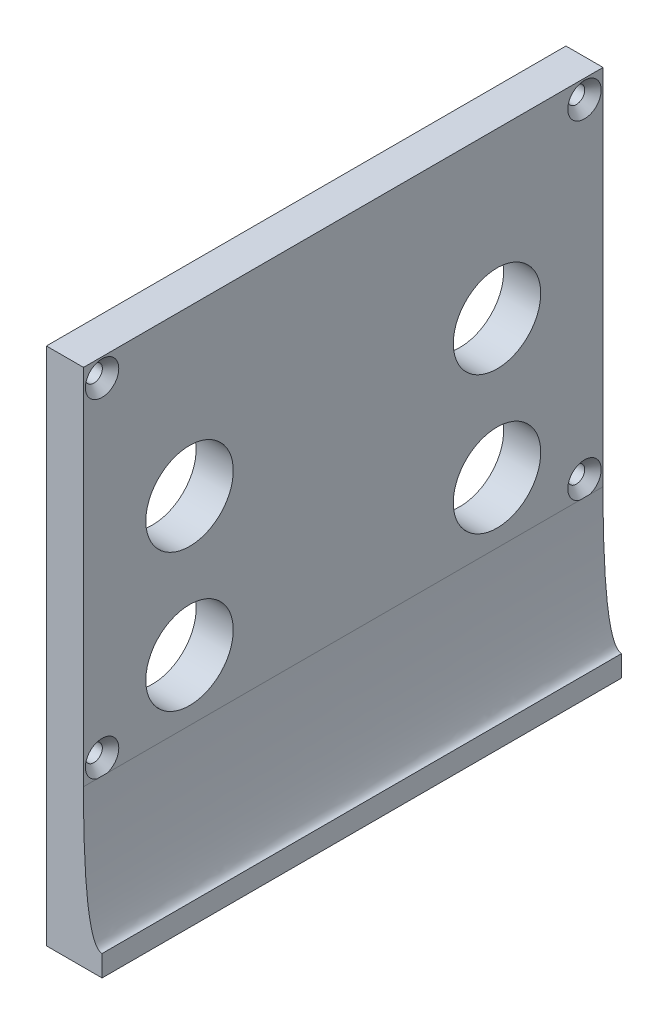
ISO-10303-21;
HEADER;
FILE_DESCRIPTION(('STEP AP214'),'2;1');
FILE_NAME('part.step','',(''),(''),'','','');
FILE_SCHEMA(('AUTOMOTIVE_DESIGN { 1 0 10303 214 1 1 1 1 }'));
ENDSEC;
DATA;
#1=APPLICATION_CONTEXT('core data for automotive mechanical design processes');
#2=APPLICATION_PROTOCOL_DEFINITION('international standard','automotive_design',2000,#1);
#3=PRODUCT_CONTEXT('',#1,'mechanical');
#4=PRODUCT('Part','Part','',(#3));
#5=PRODUCT_RELATED_PRODUCT_CATEGORY('part','',(#4));
#6=PRODUCT_DEFINITION_FORMATION('','',#4);
#7=PRODUCT_DEFINITION_CONTEXT('part definition',#1,'design');
#8=PRODUCT_DEFINITION('design','',#6,#7);
#9=PRODUCT_DEFINITION_SHAPE('','',#8);
#10=(LENGTH_UNIT() NAMED_UNIT(*) SI_UNIT(.MILLI.,.METRE.));
#11=(NAMED_UNIT(*) PLANE_ANGLE_UNIT() SI_UNIT($,.RADIAN.));
#12=(NAMED_UNIT(*) SI_UNIT($,.STERADIAN.) SOLID_ANGLE_UNIT());
#13=UNCERTAINTY_MEASURE_WITH_UNIT(LENGTH_MEASURE(1.E-05),#10,'distance_accuracy_value','');
#14=(GEOMETRIC_REPRESENTATION_CONTEXT(3) GLOBAL_UNCERTAINTY_ASSIGNED_CONTEXT((#13)) GLOBAL_UNIT_ASSIGNED_CONTEXT((#10,
#11,#12)) REPRESENTATION_CONTEXT('',''));
#15=CARTESIAN_POINT('',(0.,0.,0.));
#16=DIRECTION('',(0.,0.,1.));
#17=DIRECTION('',(1.,0.,0.));
#18=AXIS2_PLACEMENT_3D('',#15,#16,#17);
#19=CARTESIAN_POINT('',(-39.838690811529,41.5674555111962,98.));
#20=DIRECTION('',(-1.,0.,0.));
#21=DIRECTION('',(0.,0.,1.));
#22=AXIS2_PLACEMENT_3D('',#19,#20,#21);
#23=PLANE('',#22);
#24=CARTESIAN_POINT('',(-39.838690811529,38.0674555111962,94.5));
#25=DIRECTION('',(1.,0.,0.));
#26=DIRECTION('',(0.,0.,-1.));
#27=AXIS2_PLACEMENT_3D('',#24,#25,#26);
#28=CIRCLE('',#27,3.15);
#29=CARTESIAN_POINT('',(-39.838690811529,38.0674555111962,91.35));
#30=VERTEX_POINT('',#29);
#31=EDGE_CURVE('E160',#30,#30,#28,.T.);
#32=ORIENTED_EDGE('',*,*,#31,.F.);
#33=EDGE_LOOP('',(#32));
#34=FACE_BOUND('',#33,.T.);
#35=CARTESIAN_POINT('',(-39.838690811529,38.0674555111962,3.50000000000002));
#36=DIRECTION('',(1.,0.,0.));
#37=DIRECTION('',(0.,0.,-1.));
#38=AXIS2_PLACEMENT_3D('',#35,#36,#37);
#39=CIRCLE('',#38,3.15);
#40=CARTESIAN_POINT('',(-39.838690811529,38.0674555111962,0.350000000000017));
#41=VERTEX_POINT('',#40);
#42=EDGE_CURVE('E183',#41,#41,#39,.T.);
#43=ORIENTED_EDGE('',*,*,#42,.F.);
#44=EDGE_LOOP('',(#43));
#45=FACE_BOUND('',#44,.T.);
#46=CARTESIAN_POINT('',(-39.838690811529,-15.4325444888038,20.));
#47=DIRECTION('',(-1.,0.,0.));
#48=DIRECTION('',(0.,0.,1.));
#49=AXIS2_PLACEMENT_3D('',#46,#47,#48);
#50=CIRCLE('',#49,8.25);
#51=CARTESIAN_POINT('',(-39.838690811529,-15.4325444888038,28.25));
#52=VERTEX_POINT('',#51);
#53=EDGE_CURVE('E257',#52,#52,#50,.T.);
#54=ORIENTED_EDGE('',*,*,#53,.T.);
#55=EDGE_LOOP('',(#54));
#56=FACE_BOUND('',#55,.T.);
#57=CARTESIAN_POINT('',(-39.838690811529,10.5674555111962,78.));
#58=DIRECTION('',(-1.,0.,0.));
#59=DIRECTION('',(0.,0.,1.));
#60=AXIS2_PLACEMENT_3D('',#57,#58,#59);
#61=CIRCLE('',#60,8.25000000000001);
#62=CARTESIAN_POINT('',(-39.838690811529,10.5674555111962,86.25));
#63=VERTEX_POINT('',#62);
#64=EDGE_CURVE('E261',#63,#63,#61,.T.);
#65=ORIENTED_EDGE('',*,*,#64,.T.);
#66=EDGE_LOOP('',(#65));
#67=FACE_BOUND('',#66,.T.);
#68=CARTESIAN_POINT('',(-39.838690811529,-15.4325444888038,78.));
#69=DIRECTION('',(-1.,0.,0.));
#70=DIRECTION('',(0.,0.,1.));
#71=AXIS2_PLACEMENT_3D('',#68,#69,#70);
#72=CIRCLE('',#71,8.25);
#73=CARTESIAN_POINT('',(-39.838690811529,-15.4325444888038,86.25));
#74=VERTEX_POINT('',#73);
#75=EDGE_CURVE('E265',#74,#74,#72,.T.);
#76=ORIENTED_EDGE('',*,*,#75,.T.);
#77=EDGE_LOOP('',(#76));
#78=FACE_BOUND('',#77,.T.);
#79=CARTESIAN_POINT('',(-39.838690811529,10.5674555111962,20.));
#80=DIRECTION('',(-1.,0.,0.));
#81=DIRECTION('',(0.,0.,1.));
#82=AXIS2_PLACEMENT_3D('',#79,#80,#81);
#83=CIRCLE('',#82,8.25);
#84=CARTESIAN_POINT('',(-39.838690811529,10.5674555111962,28.25));
#85=VERTEX_POINT('',#84);
#86=EDGE_CURVE('E202',#85,#85,#83,.T.);
#87=ORIENTED_EDGE('',*,*,#86,.T.);
#88=EDGE_LOOP('',(#87));
#89=FACE_BOUND('',#88,.T.);
#90=CARTESIAN_POINT('',(-39.838690811529,-23.9325444888039,94.5));
#91=DIRECTION('',(1.,0.,0.));
#92=DIRECTION('',(0.,0.,-1.));
#93=AXIS2_PLACEMENT_3D('',#90,#91,#92);
#94=CIRCLE('',#93,3.15);
#95=CARTESIAN_POINT('',(-39.838690811529,-26.9325444888039,93.5395313643851));
#96=VERTEX_POINT('',#95);
#97=CARTESIAN_POINT('',(-39.838690811529,-26.9325444888039,95.4604686356149));
#98=VERTEX_POINT('',#97);
#99=EDGE_CURVE('E171',#96,#98,#94,.T.);
#100=ORIENTED_EDGE('',*,*,#99,.F.);
#101=DIRECTION('',(0.,0.,-1.));
#102=VECTOR('',#101,1.);
#103=CARTESIAN_POINT('',(-39.838690811529,-26.9325444888039,98.));
#104=LINE('',#103,#102);
#105=CARTESIAN_POINT('',(-39.838690811529,-26.9325444888039,4.46046863561494));
#106=VERTEX_POINT('',#105);
#107=EDGE_CURVE('E273',#96,#106,#104,.T.);
#108=ORIENTED_EDGE('',*,*,#107,.T.);
#109=CARTESIAN_POINT('',(-39.838690811529,-23.9325444888039,3.50000000000002));
#110=DIRECTION('',(1.,0.,0.));
#111=DIRECTION('',(0.,0.,-1.));
#112=AXIS2_PLACEMENT_3D('',#109,#110,#111);
#113=CIRCLE('',#112,3.15);
#114=CARTESIAN_POINT('',(-39.838690811529,-26.9325444888039,2.5395313643851));
#115=VERTEX_POINT('',#114);
#116=EDGE_CURVE('E179',#115,#106,#113,.T.);
#117=ORIENTED_EDGE('',*,*,#116,.F.);
#118=CARTESIAN_POINT('',(-39.838690811529,-26.9325444888039,0.));
#119=VERTEX_POINT('',#118);
#120=EDGE_CURVE('E286',#115,#119,#104,.T.);
#121=ORIENTED_EDGE('',*,*,#120,.T.);
#122=DIRECTION('',(0.,1.,0.));
#123=VECTOR('',#122,1.);
#124=CARTESIAN_POINT('',(-39.838690811529,41.5674555111962,0.));
#125=LINE('',#124,#123);
#126=CARTESIAN_POINT('',(-39.838690811529,41.5674555111962,0.));
#127=VERTEX_POINT('',#126);
#128=EDGE_CURVE('E207',#119,#127,#125,.T.);
#129=ORIENTED_EDGE('',*,*,#128,.T.);
#130=DIRECTION('',(0.,0.,-1.));
#131=VECTOR('',#130,1.);
#132=CARTESIAN_POINT('',(-39.838690811529,41.5674555111962,98.));
#133=LINE('',#132,#131);
#134=CARTESIAN_POINT('',(-39.838690811529,41.5674555111962,98.));
#135=VERTEX_POINT('',#134);
#136=EDGE_CURVE('E316',#135,#127,#133,.T.);
#137=ORIENTED_EDGE('',*,*,#136,.F.);
#138=DIRECTION('',(0.,1.,0.));
#139=VECTOR('',#138,1.);
#140=CARTESIAN_POINT('',(-39.838690811529,41.5674555111962,98.));
#141=LINE('',#140,#139);
#142=CARTESIAN_POINT('',(-39.838690811529,-26.9325444888039,98.));
#143=VERTEX_POINT('',#142);
#144=EDGE_CURVE('E218',#143,#135,#141,.T.);
#145=ORIENTED_EDGE('',*,*,#144,.F.);
#146=EDGE_CURVE('E277',#143,#98,#104,.T.);
#147=ORIENTED_EDGE('',*,*,#146,.T.);
#148=EDGE_LOOP('',(#100,#108,#117,#121,#129,#137,#145,#147));
#149=FACE_BOUND('',#148,.T.);
#150=ADVANCED_FACE('F34',(#34,#45,#56,#67,#78,#89,#149),#23,.F.);
#151=CARTESIAN_POINT('',(-46.838690811529,41.5674555111962,98.));
#152=DIRECTION('',(0.,-1.,0.));
#153=DIRECTION('',(0.,0.,-1.));
#154=AXIS2_PLACEMENT_3D('',#151,#152,#153);
#155=PLANE('',#154);
#156=DIRECTION('',(-1.,0.,0.));
#157=VECTOR('',#156,1.);
#158=CARTESIAN_POINT('',(-46.838690811529,41.5674555111962,0.));
#159=LINE('',#158,#157);
#160=CARTESIAN_POINT('',(-46.838690811529,41.5674555111962,0.));
#161=VERTEX_POINT('',#160);
#162=EDGE_CURVE('E304',#127,#161,#159,.T.);
#163=ORIENTED_EDGE('',*,*,#162,.T.);
#164=DIRECTION('',(0.,0.,-1.));
#165=VECTOR('',#164,1.);
#166=CARTESIAN_POINT('',(-46.838690811529,41.5674555111962,98.));
#167=LINE('',#166,#165);
#168=CARTESIAN_POINT('',(-46.838690811529,41.5674555111962,98.));
#169=VERTEX_POINT('',#168);
#170=EDGE_CURVE('E11',#169,#161,#167,.T.);
#171=ORIENTED_EDGE('',*,*,#170,.F.);
#172=DIRECTION('',(-1.,0.,0.));
#173=VECTOR('',#172,1.);
#174=CARTESIAN_POINT('',(-46.838690811529,41.5674555111962,98.));
#175=LINE('',#174,#173);
#176=EDGE_CURVE('E203',#135,#169,#175,.T.);
#177=ORIENTED_EDGE('',*,*,#176,.F.);
#178=ORIENTED_EDGE('',*,*,#136,.T.);
#179=EDGE_LOOP('',(#163,#171,#177,#178));
#180=FACE_BOUND('',#179,.T.);
#181=ADVANCED_FACE('F36',(#180),#155,.F.);
#182=CARTESIAN_POINT('',(-46.838690811529,41.5674555111962,98.));
#183=DIRECTION('',(1.,0.,0.));
#184=DIRECTION('',(0.,0.,-1.));
#185=AXIS2_PLACEMENT_3D('',#182,#183,#184);
#186=PLANE('',#185);
#187=DIRECTION('',(0.,0.,1.));
#188=VECTOR('',#187,1.);
#189=CARTESIAN_POINT('',(-46.838690811529,33.0674555111962,39.5));
#190=LINE('',#189,#188);
#191=CARTESIAN_POINT('',(-46.838690811529,33.0674555111962,39.5));
#192=VERTEX_POINT('',#191);
#193=CARTESIAN_POINT('',(-46.838690811529,33.0674555111962,69.));
#194=VERTEX_POINT('',#193);
#195=EDGE_CURVE('E154',#192,#194,#190,.T.);
#196=ORIENTED_EDGE('',*,*,#195,.F.);
#197=DIRECTION('',(0.,-1.,0.));
#198=VECTOR('',#197,1.);
#199=CARTESIAN_POINT('',(-46.838690811529,40.0674555111962,39.5));
#200=LINE('',#199,#198);
#201=CARTESIAN_POINT('',(-46.838690811529,40.0674555111962,39.5));
#202=VERTEX_POINT('',#201);
#203=EDGE_CURVE('E51',#202,#192,#200,.T.);
#204=ORIENTED_EDGE('',*,*,#203,.F.);
#205=DIRECTION('',(0.,0.,-1.));
#206=VECTOR('',#205,1.);
#207=CARTESIAN_POINT('',(-46.838690811529,40.0674555111962,39.5));
#208=LINE('',#207,#206);
#209=CARTESIAN_POINT('',(-46.838690811529,40.0674555111962,69.));
#210=VERTEX_POINT('',#209);
#211=EDGE_CURVE('E145',#210,#202,#208,.T.);
#212=ORIENTED_EDGE('',*,*,#211,.F.);
#213=DIRECTION('',(0.,1.,0.));
#214=VECTOR('',#213,1.);
#215=CARTESIAN_POINT('',(-46.838690811529,40.0674555111962,69.));
#216=LINE('',#215,#214);
#217=EDGE_CURVE('E148',#194,#210,#216,.T.);
#218=ORIENTED_EDGE('',*,*,#217,.F.);
#219=EDGE_LOOP('',(#196,#204,#212,#218));
#220=FACE_BOUND('',#219,.T.);
#221=CARTESIAN_POINT('',(-46.838690811529,38.0674555111962,94.5));
#222=DIRECTION('',(1.,0.,0.));
#223=DIRECTION('',(0.,0.,-1.));
#224=AXIS2_PLACEMENT_3D('',#221,#222,#223);
#225=CIRCLE('',#224,1.59999999999999);
#226=CARTESIAN_POINT('',(-46.838690811529,38.0674555111962,92.9));
#227=VERTEX_POINT('',#226);
#228=EDGE_CURVE('E38',#227,#227,#225,.T.);
#229=ORIENTED_EDGE('',*,*,#228,.T.);
#230=EDGE_LOOP('',(#229));
#231=FACE_BOUND('',#230,.T.);
#232=CARTESIAN_POINT('',(-46.838690811529,-23.9325444888039,94.5));
#233=DIRECTION('',(1.,0.,0.));
#234=DIRECTION('',(0.,0.,-1.));
#235=AXIS2_PLACEMENT_3D('',#232,#233,#234);
#236=CIRCLE('',#235,1.59999999999999);
#237=CARTESIAN_POINT('',(-46.838690811529,-23.9325444888039,92.9));
#238=VERTEX_POINT('',#237);
#239=EDGE_CURVE('E174',#238,#238,#236,.T.);
#240=ORIENTED_EDGE('',*,*,#239,.T.);
#241=EDGE_LOOP('',(#240));
#242=FACE_BOUND('',#241,.T.);
#243=CARTESIAN_POINT('',(-46.838690811529,-23.9325444888039,3.50000000000002));
#244=DIRECTION('',(1.,0.,0.));
#245=DIRECTION('',(0.,0.,-1.));
#246=AXIS2_PLACEMENT_3D('',#243,#244,#245);
#247=CIRCLE('',#246,1.59999999999999);
#248=CARTESIAN_POINT('',(-46.838690811529,-23.9325444888039,1.90000000000003));
#249=VERTEX_POINT('',#248);
#250=EDGE_CURVE('E182',#249,#249,#247,.T.);
#251=ORIENTED_EDGE('',*,*,#250,.T.);
#252=EDGE_LOOP('',(#251));
#253=FACE_BOUND('',#252,.T.);
#254=CARTESIAN_POINT('',(-46.838690811529,38.0674555111962,3.50000000000002));
#255=DIRECTION('',(1.,0.,0.));
#256=DIRECTION('',(0.,0.,-1.));
#257=AXIS2_PLACEMENT_3D('',#254,#255,#256);
#258=CIRCLE('',#257,1.59999999999999);
#259=CARTESIAN_POINT('',(-46.838690811529,38.0674555111962,1.90000000000003));
#260=VERTEX_POINT('',#259);
#261=EDGE_CURVE('E189',#260,#260,#258,.T.);
#262=ORIENTED_EDGE('',*,*,#261,.T.);
#263=EDGE_LOOP('',(#262));
#264=FACE_BOUND('',#263,.T.);
#265=CARTESIAN_POINT('',(-46.838690811529,-15.4325444888038,20.));
#266=DIRECTION('',(-1.,0.,0.));
#267=DIRECTION('',(0.,0.,1.));
#268=AXIS2_PLACEMENT_3D('',#265,#266,#267);
#269=CIRCLE('',#268,8.25);
#270=CARTESIAN_POINT('',(-46.838690811529,-15.4325444888038,28.25));
#271=VERTEX_POINT('',#270);
#272=EDGE_CURVE('E197',#271,#271,#269,.T.);
#273=ORIENTED_EDGE('',*,*,#272,.F.);
#274=EDGE_LOOP('',(#273));
#275=FACE_BOUND('',#274,.T.);
#276=CARTESIAN_POINT('',(-46.838690811529,10.5674555111962,78.));
#277=DIRECTION('',(-1.,0.,0.));
#278=DIRECTION('',(0.,0.,1.));
#279=AXIS2_PLACEMENT_3D('',#276,#277,#278);
#280=CIRCLE('',#279,8.25000000000001);
#281=CARTESIAN_POINT('',(-46.838690811529,10.5674555111962,86.25));
#282=VERTEX_POINT('',#281);
#283=EDGE_CURVE('E194',#282,#282,#280,.T.);
#284=ORIENTED_EDGE('',*,*,#283,.F.);
#285=EDGE_LOOP('',(#284));
#286=FACE_BOUND('',#285,.T.);
#287=CARTESIAN_POINT('',(-46.838690811529,-15.4325444888038,78.));
#288=DIRECTION('',(-1.,0.,0.));
#289=DIRECTION('',(0.,0.,1.));
#290=AXIS2_PLACEMENT_3D('',#287,#288,#289);
#291=CIRCLE('',#290,8.25);
#292=CARTESIAN_POINT('',(-46.838690811529,-15.4325444888038,86.25));
#293=VERTEX_POINT('',#292);
#294=EDGE_CURVE('E190',#293,#293,#291,.T.);
#295=ORIENTED_EDGE('',*,*,#294,.F.);
#296=EDGE_LOOP('',(#295));
#297=FACE_BOUND('',#296,.T.);
#298=CARTESIAN_POINT('',(-46.838690811529,10.5674555111962,20.));
#299=DIRECTION('',(-1.,0.,0.));
#300=DIRECTION('',(0.,0.,1.));
#301=AXIS2_PLACEMENT_3D('',#298,#299,#300);
#302=CIRCLE('',#301,8.25);
#303=CARTESIAN_POINT('',(-46.838690811529,10.5674555111962,28.25));
#304=VERTEX_POINT('',#303);
#305=EDGE_CURVE('E193',#304,#304,#302,.T.);
#306=ORIENTED_EDGE('',*,*,#305,.F.);
#307=EDGE_LOOP('',(#306));
#308=FACE_BOUND('',#307,.T.);
#309=DIRECTION('',(0.,-1.,0.));
#310=VECTOR('',#309,1.);
#311=CARTESIAN_POINT('',(-46.838690811529,41.5674555111962,0.));
#312=LINE('',#311,#310);
#313=CARTESIAN_POINT('',(-46.838690811529,-56.4325444888039,0.));
#314=VERTEX_POINT('',#313);
#315=EDGE_CURVE('E334',#161,#314,#312,.T.);
#316=ORIENTED_EDGE('',*,*,#315,.T.);
#317=DIRECTION('',(0.,0.,-1.));
#318=VECTOR('',#317,1.);
#319=CARTESIAN_POINT('',(-46.838690811529,-56.4325444888039,98.));
#320=LINE('',#319,#318);
#321=CARTESIAN_POINT('',(-46.838690811529,-56.4325444888039,98.));
#322=VERTEX_POINT('',#321);
#323=EDGE_CURVE('E43',#322,#314,#320,.T.);
#324=ORIENTED_EDGE('',*,*,#323,.F.);
#325=DIRECTION('',(0.,-1.,0.));
#326=VECTOR('',#325,1.);
#327=CARTESIAN_POINT('',(-46.838690811529,41.5674555111962,98.));
#328=LINE('',#327,#326);
#329=EDGE_CURVE('E206',#169,#322,#328,.T.);
#330=ORIENTED_EDGE('',*,*,#329,.F.);
#331=ORIENTED_EDGE('',*,*,#170,.T.);
#332=EDGE_LOOP('',(#316,#324,#330,#331));
#333=FACE_BOUND('',#332,.T.);
#334=ADVANCED_FACE('F237',(#220,#231,#242,#253,#264,#275,#286,#297,#308,#333),#186,.F.);
#335=CARTESIAN_POINT('',(-46.838690811529,-56.4325444888039,98.));
#336=DIRECTION('',(0.,1.,0.));
#337=DIRECTION('',(0.,0.,1.));
#338=AXIS2_PLACEMENT_3D('',#335,#336,#337);
#339=PLANE('',#338);
#340=DIRECTION('',(1.,0.,0.));
#341=VECTOR('',#340,1.);
#342=CARTESIAN_POINT('',(-46.838690811529,-56.4325444888039,0.));
#343=LINE('',#342,#341);
#344=CARTESIAN_POINT('',(-36.338690811529,-56.4325444888039,0.));
#345=VERTEX_POINT('',#344);
#346=EDGE_CURVE('E332',#314,#345,#343,.T.);
#347=ORIENTED_EDGE('',*,*,#346,.T.);
#348=DIRECTION('',(0.,0.,-1.));
#349=VECTOR('',#348,1.);
#350=CARTESIAN_POINT('',(-36.338690811529,-56.4325444888039,98.));
#351=LINE('',#350,#349);
#352=CARTESIAN_POINT('',(-36.338690811529,-56.4325444888039,98.));
#353=VERTEX_POINT('',#352);
#354=EDGE_CURVE('E291',#353,#345,#351,.T.);
#355=ORIENTED_EDGE('',*,*,#354,.F.);
#356=DIRECTION('',(1.,0.,0.));
#357=VECTOR('',#356,1.);
#358=CARTESIAN_POINT('',(-46.838690811529,-56.4325444888039,98.));
#359=LINE('',#358,#357);
#360=EDGE_CURVE('E209',#322,#353,#359,.T.);
#361=ORIENTED_EDGE('',*,*,#360,.F.);
#362=ORIENTED_EDGE('',*,*,#323,.T.);
#363=EDGE_LOOP('',(#347,#355,#361,#362));
#364=FACE_BOUND('',#363,.T.);
#365=ADVANCED_FACE('F234',(#364),#339,.F.);
#366=CARTESIAN_POINT('',(-36.338690811529,-56.4325444888039,98.));
#367=DIRECTION('',(-1.,0.,0.));
#368=DIRECTION('',(0.,0.,1.));
#369=AXIS2_PLACEMENT_3D('',#366,#367,#368);
#370=PLANE('',#369);
#371=DIRECTION('',(0.,1.,0.));
#372=VECTOR('',#371,1.);
#373=CARTESIAN_POINT('',(-36.338690811529,-56.4325444888039,0.));
#374=LINE('',#373,#372);
#375=CARTESIAN_POINT('',(-36.338690811529,-52.4325444888039,0.));
#376=VERTEX_POINT('',#375);
#377=EDGE_CURVE('E327',#345,#376,#374,.T.);
#378=ORIENTED_EDGE('',*,*,#377,.T.);
#379=DIRECTION('',(0.,0.,-1.));
#380=VECTOR('',#379,1.);
#381=CARTESIAN_POINT('',(-36.338690811529,-52.4325444888039,98.));
#382=LINE('',#381,#380);
#383=CARTESIAN_POINT('',(-36.338690811529,-52.4325444888039,98.));
#384=VERTEX_POINT('',#383);
#385=EDGE_CURVE('E289',#384,#376,#382,.T.);
#386=ORIENTED_EDGE('',*,*,#385,.F.);
#387=DIRECTION('',(0.,1.,0.));
#388=VECTOR('',#387,1.);
#389=CARTESIAN_POINT('',(-36.338690811529,-56.4325444888039,98.));
#390=LINE('',#389,#388);
#391=EDGE_CURVE('E211',#353,#384,#390,.T.);
#392=ORIENTED_EDGE('',*,*,#391,.F.);
#393=ORIENTED_EDGE('',*,*,#354,.T.);
#394=EDGE_LOOP('',(#378,#386,#392,#393));
#395=FACE_BOUND('',#394,.T.);
#396=ADVANCED_FACE('F229',(#395),#370,.F.);
#397=CARTESIAN_POINT('',(-36.338690811529,-52.4325444888039,98.));
#398=CARTESIAN_POINT('',(-39.838690811529,-52.4325444888039,98.));
#399=CARTESIAN_POINT('',(-39.838690811529,-26.9325444888039,98.));
#400=B_SPLINE_CURVE_WITH_KNOTS('',2,(#397,#398,#399),.UNSPECIFIED.,.F.,.F.,(3,3),(0.,1.),.UNSPECIFIED.);
#401=DIRECTION('',(0.,0.,-1.));
#402=VECTOR('',#401,1.);
#403=SURFACE_OF_LINEAR_EXTRUSION('',#400,#402);
#404=CARTESIAN_POINT('',(-36.338690811529,-52.4325444888039,0.));
#405=CARTESIAN_POINT('',(-39.838690811529,-52.4325444888039,0.));
#406=CARTESIAN_POINT('',(-39.838690811529,-26.9325444888039,0.));
#407=B_SPLINE_CURVE_WITH_KNOTS('',2,(#404,#405,#406),.UNSPECIFIED.,.F.,.F.,(3,3),(0.,1.),.UNSPECIFIED.);
#408=EDGE_CURVE('E314',#376,#119,#407,.T.);
#409=ORIENTED_EDGE('',*,*,#408,.T.);
#410=ORIENTED_EDGE('',*,*,#120,.F.);
#411=EDGE_CURVE('E284',#106,#115,#104,.T.);
#412=ORIENTED_EDGE('',*,*,#411,.F.);
#413=ORIENTED_EDGE('',*,*,#107,.F.);
#414=EDGE_CURVE('E282',#98,#96,#104,.T.);
#415=ORIENTED_EDGE('',*,*,#414,.F.);
#416=ORIENTED_EDGE('',*,*,#146,.F.);
#417=EDGE_CURVE('E213',#384,#143,#400,.T.);
#418=ORIENTED_EDGE('',*,*,#417,.F.);
#419=ORIENTED_EDGE('',*,*,#385,.T.);
#420=EDGE_LOOP('',(#409,#410,#412,#413,#415,#416,#418,#419));
#421=FACE_BOUND('',#420,.T.);
#422=ADVANCED_FACE('F224',(#421),#403,.F.);
#423=CARTESIAN_POINT('',(-38.963690811529,-46.0575444888039,98.));
#424=DIRECTION('',(0.,0.,-1.));
#425=DIRECTION('',(-1.,0.,0.));
#426=AXIS2_PLACEMENT_3D('',#423,#424,#425);
#427=PLANE('',#426);
#428=ORIENTED_EDGE('',*,*,#176,.T.);
#429=ORIENTED_EDGE('',*,*,#329,.T.);
#430=ORIENTED_EDGE('',*,*,#360,.T.);
#431=ORIENTED_EDGE('',*,*,#391,.T.);
#432=ORIENTED_EDGE('',*,*,#417,.T.);
#433=ORIENTED_EDGE('',*,*,#144,.T.);
#434=EDGE_LOOP('',(#428,#429,#430,#431,#432,#433));
#435=FACE_BOUND('',#434,.T.);
#436=ADVANCED_FACE('F228',(#435),#427,.F.);
#437=CARTESIAN_POINT('',(-38.963690811529,-46.0575444888039,0.));
#438=DIRECTION('',(0.,0.,-1.));
#439=DIRECTION('',(-1.,0.,0.));
#440=AXIS2_PLACEMENT_3D('',#437,#438,#439);
#441=PLANE('',#440);
#442=ORIENTED_EDGE('',*,*,#162,.F.);
#443=ORIENTED_EDGE('',*,*,#128,.F.);
#444=ORIENTED_EDGE('',*,*,#408,.F.);
#445=ORIENTED_EDGE('',*,*,#377,.F.);
#446=ORIENTED_EDGE('',*,*,#346,.F.);
#447=ORIENTED_EDGE('',*,*,#315,.F.);
#448=EDGE_LOOP('',(#442,#443,#444,#445,#446,#447));
#449=FACE_BOUND('',#448,.T.);
#450=ADVANCED_FACE('F337',(#449),#441,.T.);
#451=CARTESIAN_POINT('',(-36.338690811529,10.5674555111962,20.));
#452=DIRECTION('',(-1.,0.,0.));
#453=DIRECTION('',(0.,0.,1.));
#454=AXIS2_PLACEMENT_3D('',#451,#452,#453);
#455=CYLINDRICAL_SURFACE('',#454,8.25);
#456=ORIENTED_EDGE('',*,*,#305,.T.);
#457=EDGE_LOOP('',(#456));
#458=FACE_BOUND('',#457,.T.);
#459=ORIENTED_EDGE('',*,*,#86,.F.);
#460=EDGE_LOOP('',(#459));
#461=FACE_BOUND('',#460,.T.);
#462=ADVANCED_FACE('F351',(#458,#461),#455,.F.);
#463=CARTESIAN_POINT('',(-36.338690811529,-15.4325444888038,78.));
#464=DIRECTION('',(-1.,0.,0.));
#465=DIRECTION('',(0.,0.,1.));
#466=AXIS2_PLACEMENT_3D('',#463,#464,#465);
#467=CYLINDRICAL_SURFACE('',#466,8.25);
#468=ORIENTED_EDGE('',*,*,#294,.T.);
#469=EDGE_LOOP('',(#468));
#470=FACE_BOUND('',#469,.T.);
#471=ORIENTED_EDGE('',*,*,#75,.F.);
#472=EDGE_LOOP('',(#471));
#473=FACE_BOUND('',#472,.T.);
#474=ADVANCED_FACE('F355',(#470,#473),#467,.F.);
#475=CARTESIAN_POINT('',(-36.338690811529,10.5674555111962,78.));
#476=DIRECTION('',(-1.,0.,0.));
#477=DIRECTION('',(0.,0.,1.));
#478=AXIS2_PLACEMENT_3D('',#475,#476,#477);
#479=CYLINDRICAL_SURFACE('',#478,8.25000000000001);
#480=ORIENTED_EDGE('',*,*,#283,.T.);
#481=EDGE_LOOP('',(#480));
#482=FACE_BOUND('',#481,.T.);
#483=ORIENTED_EDGE('',*,*,#64,.F.);
#484=EDGE_LOOP('',(#483));
#485=FACE_BOUND('',#484,.T.);
#486=ADVANCED_FACE('F361',(#482,#485),#479,.F.);
#487=CARTESIAN_POINT('',(-36.338690811529,-15.4325444888038,20.));
#488=DIRECTION('',(-1.,0.,0.));
#489=DIRECTION('',(0.,0.,1.));
#490=AXIS2_PLACEMENT_3D('',#487,#488,#489);
#491=CYLINDRICAL_SURFACE('',#490,8.25);
#492=ORIENTED_EDGE('',*,*,#272,.T.);
#493=EDGE_LOOP('',(#492));
#494=FACE_BOUND('',#493,.T.);
#495=ORIENTED_EDGE('',*,*,#53,.F.);
#496=EDGE_LOOP('',(#495));
#497=FACE_BOUND('',#496,.T.);
#498=ADVANCED_FACE('F357',(#494,#497),#491,.F.);
#499=CARTESIAN_POINT('',(-39.838690811529,38.0674555111962,3.50000000000002));
#500=DIRECTION('',(1.,0.,0.));
#501=DIRECTION('',(0.,0.,-1.));
#502=AXIS2_PLACEMENT_3D('',#499,#500,#501);
#503=CYLINDRICAL_SURFACE('',#502,1.59999999999999);
#504=CARTESIAN_POINT('',(-41.388690811529,38.0674555111962,3.50000000000002));
#505=DIRECTION('',(1.,0.,0.));
#506=DIRECTION('',(0.,0.,-1.));
#507=AXIS2_PLACEMENT_3D('',#504,#505,#506);
#508=CIRCLE('',#507,1.59999999999999);
#509=CARTESIAN_POINT('',(-41.388690811529,38.0674555111962,1.90000000000003));
#510=VERTEX_POINT('',#509);
#511=EDGE_CURVE('E186',#510,#510,#508,.T.);
#512=ORIENTED_EDGE('',*,*,#511,.T.);
#513=EDGE_LOOP('',(#512));
#514=FACE_BOUND('',#513,.T.);
#515=ORIENTED_EDGE('',*,*,#261,.F.);
#516=EDGE_LOOP('',(#515));
#517=FACE_BOUND('',#516,.T.);
#518=ADVANCED_FACE('F360',(#514,#517),#503,.F.);
#519=CARTESIAN_POINT('',(-39.838690811529,38.0674555111962,3.50000000000002));
#520=DIRECTION('',(1.,0.,0.));
#521=DIRECTION('',(0.,0.,-1.));
#522=AXIS2_PLACEMENT_3D('',#519,#520,#521);
#523=CONICAL_SURFACE('',#522,3.15,0.785398163397453);
#524=ORIENTED_EDGE('',*,*,#511,.F.);
#525=EDGE_LOOP('',(#524));
#526=FACE_BOUND('',#525,.T.);
#527=ORIENTED_EDGE('',*,*,#42,.T.);
#528=EDGE_LOOP('',(#527));
#529=FACE_BOUND('',#528,.T.);
#530=ADVANCED_FACE('F371',(#526,#529),#523,.F.);
#531=CARTESIAN_POINT('',(-39.838690811529,-23.9325444888039,3.50000000000002));
#532=DIRECTION('',(1.,0.,0.));
#533=DIRECTION('',(0.,0.,-1.));
#534=AXIS2_PLACEMENT_3D('',#531,#532,#533);
#535=CYLINDRICAL_SURFACE('',#534,1.59999999999999);
#536=CARTESIAN_POINT('',(-41.388690811529,-23.9325444888039,3.50000000000002));
#537=DIRECTION('',(1.,0.,0.));
#538=DIRECTION('',(0.,0.,-1.));
#539=AXIS2_PLACEMENT_3D('',#536,#537,#538);
#540=CIRCLE('',#539,1.59999999999999);
#541=CARTESIAN_POINT('',(-41.388690811529,-23.9325444888039,1.90000000000003));
#542=VERTEX_POINT('',#541);
#543=EDGE_CURVE('E178',#542,#542,#540,.T.);
#544=ORIENTED_EDGE('',*,*,#543,.T.);
#545=EDGE_LOOP('',(#544));
#546=FACE_BOUND('',#545,.T.);
#547=ORIENTED_EDGE('',*,*,#250,.F.);
#548=EDGE_LOOP('',(#547));
#549=FACE_BOUND('',#548,.T.);
#550=ADVANCED_FACE('F375',(#546,#549),#535,.F.);
#551=CARTESIAN_POINT('',(-39.838690811529,-20.7825444888039,3.50000000000002));
#552=DIRECTION('',(1.,0.,0.));
#553=DIRECTION('',(0.,0.,-1.));
#554=AXIS2_PLACEMENT_3D('',#551,#552,#553);
#555=PLANE('',#554);
#556=ORIENTED_EDGE('',*,*,#411,.T.);
#557=EDGE_CURVE('E175',#106,#115,#113,.T.);
#558=ORIENTED_EDGE('',*,*,#557,.F.);
#559=EDGE_LOOP('',(#556,#558));
#560=FACE_BOUND('',#559,.T.);
#561=ADVANCED_FACE('F377',(#560),#555,.F.);
#562=CARTESIAN_POINT('',(-39.838690811529,-23.9325444888039,3.50000000000002));
#563=DIRECTION('',(1.,0.,0.));
#564=DIRECTION('',(0.,0.,-1.));
#565=AXIS2_PLACEMENT_3D('',#562,#563,#564);
#566=CONICAL_SURFACE('',#565,3.15,0.785398163397453);
#567=ORIENTED_EDGE('',*,*,#543,.F.);
#568=EDGE_LOOP('',(#567));
#569=FACE_BOUND('',#568,.T.);
#570=ORIENTED_EDGE('',*,*,#557,.T.);
#571=ORIENTED_EDGE('',*,*,#116,.T.);
#572=EDGE_LOOP('',(#570,#571));
#573=FACE_BOUND('',#572,.T.);
#574=ADVANCED_FACE('F313',(#569,#573),#566,.F.);
#575=CARTESIAN_POINT('',(-39.838690811529,-23.9325444888039,94.5));
#576=DIRECTION('',(1.,0.,0.));
#577=DIRECTION('',(0.,0.,-1.));
#578=AXIS2_PLACEMENT_3D('',#575,#576,#577);
#579=CYLINDRICAL_SURFACE('',#578,1.59999999999999);
#580=CARTESIAN_POINT('',(-41.388690811529,-23.9325444888039,94.5));
#581=DIRECTION('',(1.,0.,0.));
#582=DIRECTION('',(0.,0.,-1.));
#583=AXIS2_PLACEMENT_3D('',#580,#581,#582);
#584=CIRCLE('',#583,1.59999999999999);
#585=CARTESIAN_POINT('',(-41.388690811529,-23.9325444888039,92.9));
#586=VERTEX_POINT('',#585);
#587=EDGE_CURVE('E170',#586,#586,#584,.T.);
#588=ORIENTED_EDGE('',*,*,#587,.T.);
#589=EDGE_LOOP('',(#588));
#590=FACE_BOUND('',#589,.T.);
#591=ORIENTED_EDGE('',*,*,#239,.F.);
#592=EDGE_LOOP('',(#591));
#593=FACE_BOUND('',#592,.T.);
#594=ADVANCED_FACE('F386',(#590,#593),#579,.F.);
#595=CARTESIAN_POINT('',(-39.838690811529,-20.7825444888039,94.5));
#596=DIRECTION('',(1.,0.,0.));
#597=DIRECTION('',(0.,0.,-1.));
#598=AXIS2_PLACEMENT_3D('',#595,#596,#597);
#599=PLANE('',#598);
#600=ORIENTED_EDGE('',*,*,#414,.T.);
#601=EDGE_CURVE('E58',#98,#96,#94,.T.);
#602=ORIENTED_EDGE('',*,*,#601,.F.);
#603=EDGE_LOOP('',(#600,#602));
#604=FACE_BOUND('',#603,.T.);
#605=ADVANCED_FACE('F388',(#604),#599,.F.);
#606=CARTESIAN_POINT('',(-39.838690811529,-23.9325444888039,94.5));
#607=DIRECTION('',(1.,0.,0.));
#608=DIRECTION('',(0.,0.,-1.));
#609=AXIS2_PLACEMENT_3D('',#606,#607,#608);
#610=CONICAL_SURFACE('',#609,3.15,0.785398163397453);
#611=ORIENTED_EDGE('',*,*,#587,.F.);
#612=EDGE_LOOP('',(#611));
#613=FACE_BOUND('',#612,.T.);
#614=ORIENTED_EDGE('',*,*,#601,.T.);
#615=ORIENTED_EDGE('',*,*,#99,.T.);
#616=EDGE_LOOP('',(#614,#615));
#617=FACE_BOUND('',#616,.T.);
#618=ADVANCED_FACE('F391',(#613,#617),#610,.F.);
#619=CARTESIAN_POINT('',(-39.838690811529,38.0674555111962,94.5));
#620=DIRECTION('',(1.,0.,0.));
#621=DIRECTION('',(0.,0.,-1.));
#622=AXIS2_PLACEMENT_3D('',#619,#620,#621);
#623=CYLINDRICAL_SURFACE('',#622,1.59999999999999);
#624=CARTESIAN_POINT('',(-41.388690811529,38.0674555111962,94.5));
#625=DIRECTION('',(1.,0.,0.));
#626=DIRECTION('',(0.,0.,-1.));
#627=AXIS2_PLACEMENT_3D('',#624,#625,#626);
#628=CIRCLE('',#627,1.59999999999999);
#629=CARTESIAN_POINT('',(-41.388690811529,38.0674555111962,92.9));
#630=VERTEX_POINT('',#629);
#631=EDGE_CURVE('E166',#630,#630,#628,.T.);
#632=ORIENTED_EDGE('',*,*,#631,.T.);
#633=EDGE_LOOP('',(#632));
#634=FACE_BOUND('',#633,.T.);
#635=ORIENTED_EDGE('',*,*,#228,.F.);
#636=EDGE_LOOP('',(#635));
#637=FACE_BOUND('',#636,.T.);
#638=ADVANCED_FACE('F397',(#634,#637),#623,.F.);
#639=CARTESIAN_POINT('',(-39.838690811529,38.0674555111962,94.5));
#640=DIRECTION('',(1.,0.,0.));
#641=DIRECTION('',(0.,0.,-1.));
#642=AXIS2_PLACEMENT_3D('',#639,#640,#641);
#643=CONICAL_SURFACE('',#642,3.15,0.785398163397453);
#644=ORIENTED_EDGE('',*,*,#631,.F.);
#645=EDGE_LOOP('',(#644));
#646=FACE_BOUND('',#645,.T.);
#647=ORIENTED_EDGE('',*,*,#31,.T.);
#648=EDGE_LOOP('',(#647));
#649=FACE_BOUND('',#648,.T.);
#650=ADVANCED_FACE('F401',(#646,#649),#643,.F.);
#651=CARTESIAN_POINT('',(-44.338690811529,40.0674555111962,39.5));
#652=DIRECTION('',(0.,0.,-1.));
#653=DIRECTION('',(-1.,0.,0.));
#654=AXIS2_PLACEMENT_3D('',#651,#652,#653);
#655=PLANE('',#654);
#656=ORIENTED_EDGE('',*,*,#203,.T.);
#657=DIRECTION('',(-1.,0.,0.));
#658=VECTOR('',#657,1.);
#659=CARTESIAN_POINT('',(-44.338690811529,33.0674555111962,39.5));
#660=LINE('',#659,#658);
#661=CARTESIAN_POINT('',(-44.338690811529,33.0674555111962,39.5));
#662=VERTEX_POINT('',#661);
#663=EDGE_CURVE('E123',#662,#192,#660,.T.);
#664=ORIENTED_EDGE('',*,*,#663,.F.);
#665=DIRECTION('',(0.,-1.,0.));
#666=VECTOR('',#665,1.);
#667=CARTESIAN_POINT('',(-44.338690811529,40.0674555111962,39.5));
#668=LINE('',#667,#666);
#669=CARTESIAN_POINT('',(-44.338690811529,40.0674555111962,39.5));
#670=VERTEX_POINT('',#669);
#671=EDGE_CURVE('E127',#670,#662,#668,.T.);
#672=ORIENTED_EDGE('',*,*,#671,.F.);
#673=DIRECTION('',(-1.,0.,0.));
#674=VECTOR('',#673,1.);
#675=CARTESIAN_POINT('',(-44.338690811529,40.0674555111962,39.5));
#676=LINE('',#675,#674);
#677=EDGE_CURVE('E158',#670,#202,#676,.T.);
#678=ORIENTED_EDGE('',*,*,#677,.T.);
#679=EDGE_LOOP('',(#656,#664,#672,#678));
#680=FACE_BOUND('',#679,.T.);
#681=ADVANCED_FACE('F125',(#680),#655,.F.);
#682=CARTESIAN_POINT('',(-44.338690811529,40.0674555111962,39.5));
#683=DIRECTION('',(0.,1.,0.));
#684=DIRECTION('',(0.,0.,1.));
#685=AXIS2_PLACEMENT_3D('',#682,#683,#684);
#686=PLANE('',#685);
#687=ORIENTED_EDGE('',*,*,#211,.T.);
#688=ORIENTED_EDGE('',*,*,#677,.F.);
#689=DIRECTION('',(0.,0.,-1.));
#690=VECTOR('',#689,1.);
#691=CARTESIAN_POINT('',(-44.338690811529,40.0674555111962,39.5));
#692=LINE('',#691,#690);
#693=CARTESIAN_POINT('',(-44.338690811529,40.0674555111962,69.));
#694=VERTEX_POINT('',#693);
#695=EDGE_CURVE('E133',#694,#670,#692,.T.);
#696=ORIENTED_EDGE('',*,*,#695,.F.);
#697=DIRECTION('',(-1.,0.,0.));
#698=VECTOR('',#697,1.);
#699=CARTESIAN_POINT('',(-44.338690811529,40.0674555111962,69.));
#700=LINE('',#699,#698);
#701=EDGE_CURVE('E161',#694,#210,#700,.T.);
#702=ORIENTED_EDGE('',*,*,#701,.T.);
#703=EDGE_LOOP('',(#687,#688,#696,#702));
#704=FACE_BOUND('',#703,.T.);
#705=ADVANCED_FACE('F408',(#704),#686,.F.);
#706=CARTESIAN_POINT('',(-44.338690811529,40.0674555111962,69.));
#707=DIRECTION('',(0.,0.,1.));
#708=DIRECTION('',(1.,0.,0.));
#709=AXIS2_PLACEMENT_3D('',#706,#707,#708);
#710=PLANE('',#709);
#711=ORIENTED_EDGE('',*,*,#217,.T.);
#712=ORIENTED_EDGE('',*,*,#701,.F.);
#713=DIRECTION('',(0.,1.,0.));
#714=VECTOR('',#713,1.);
#715=CARTESIAN_POINT('',(-44.338690811529,40.0674555111962,69.));
#716=LINE('',#715,#714);
#717=CARTESIAN_POINT('',(-44.338690811529,33.0674555111962,69.));
#718=VERTEX_POINT('',#717);
#719=EDGE_CURVE('E141',#718,#694,#716,.T.);
#720=ORIENTED_EDGE('',*,*,#719,.F.);
#721=DIRECTION('',(-1.,0.,0.));
#722=VECTOR('',#721,1.);
#723=CARTESIAN_POINT('',(-44.338690811529,33.0674555111962,69.));
#724=LINE('',#723,#722);
#725=EDGE_CURVE('E132',#718,#194,#724,.T.);
#726=ORIENTED_EDGE('',*,*,#725,.T.);
#727=EDGE_LOOP('',(#711,#712,#720,#726));
#728=FACE_BOUND('',#727,.T.);
#729=ADVANCED_FACE('F411',(#728),#710,.F.);
#730=CARTESIAN_POINT('',(-44.338690811529,33.0674555111962,39.5));
#731=DIRECTION('',(0.,-1.,0.));
#732=DIRECTION('',(0.,0.,-1.));
#733=AXIS2_PLACEMENT_3D('',#730,#731,#732);
#734=PLANE('',#733);
#735=ORIENTED_EDGE('',*,*,#195,.T.);
#736=ORIENTED_EDGE('',*,*,#725,.F.);
#737=DIRECTION('',(0.,0.,1.));
#738=VECTOR('',#737,1.);
#739=CARTESIAN_POINT('',(-44.338690811529,33.0674555111962,39.5));
#740=LINE('',#739,#738);
#741=EDGE_CURVE('E136',#662,#718,#740,.T.);
#742=ORIENTED_EDGE('',*,*,#741,.F.);
#743=ORIENTED_EDGE('',*,*,#663,.T.);
#744=EDGE_LOOP('',(#735,#736,#742,#743));
#745=FACE_BOUND('',#744,.T.);
#746=ADVANCED_FACE('F137',(#745),#734,.F.);
#747=CARTESIAN_POINT('',(-44.338690811529,0.,0.));
#748=DIRECTION('',(-1.,0.,0.));
#749=DIRECTION('',(0.,0.,1.));
#750=AXIS2_PLACEMENT_3D('',#747,#748,#749);
#751=PLANE('',#750);
#752=ORIENTED_EDGE('',*,*,#671,.T.);
#753=ORIENTED_EDGE('',*,*,#741,.T.);
#754=ORIENTED_EDGE('',*,*,#719,.T.);
#755=ORIENTED_EDGE('',*,*,#695,.T.);
#756=EDGE_LOOP('',(#752,#753,#754,#755));
#757=FACE_BOUND('',#756,.T.);
#758=ADVANCED_FACE('F143',(#757),#751,.T.);
#759=CLOSED_SHELL('',(#150,#181,#334,#365,#396,#422,#436,#450,#462,#474,#486,#498,#518,#530,
#550,#561,#574,#594,#605,#618,#638,#650,#681,#705,#729,#746,#758));
#760=MANIFOLD_SOLID_BREP('B2',#759);
#761=ADVANCED_BREP_SHAPE_REPRESENTATION('',(#18,#760),#14);
#762=SHAPE_DEFINITION_REPRESENTATION(#9,#761);
ENDSEC;
END-ISO-10303-21;
